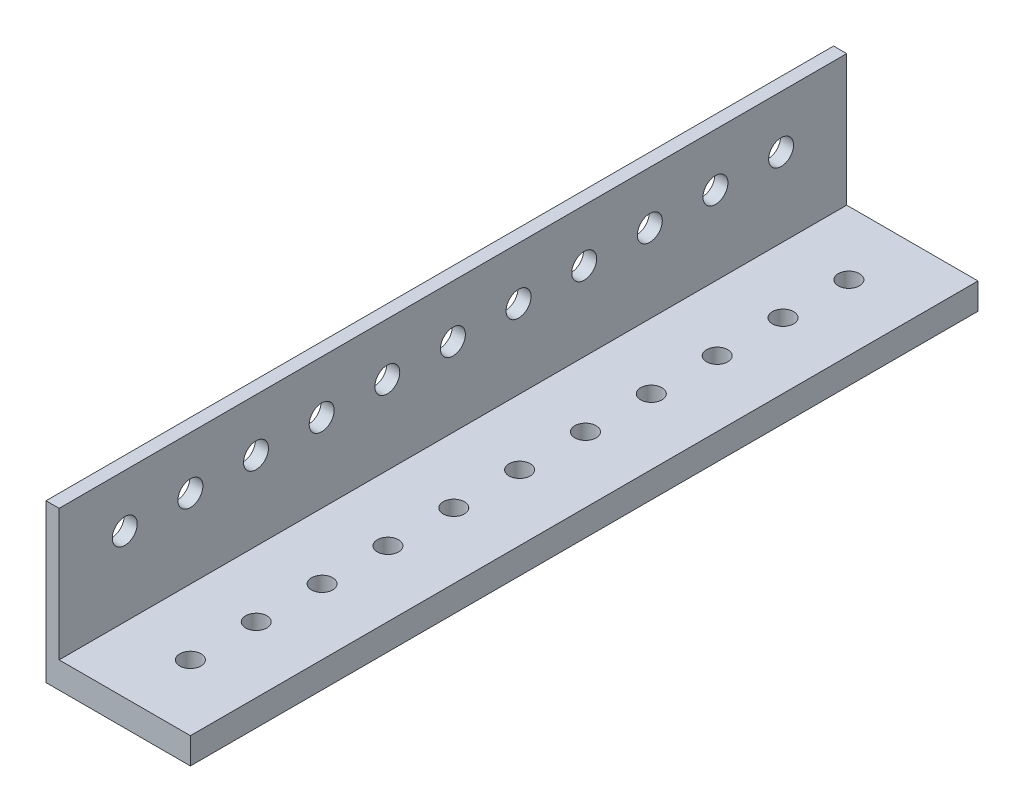
ISO-10303-21;
HEADER;
FILE_DESCRIPTION(('STEP AP214'),'2;1');
FILE_NAME('part.step','',(''),(''),'','','');
FILE_SCHEMA(('AUTOMOTIVE_DESIGN { 1 0 10303 214 1 1 1 1 }'));
ENDSEC;
DATA;
#1=APPLICATION_CONTEXT('core data for automotive mechanical design processes');
#2=APPLICATION_PROTOCOL_DEFINITION('international standard','automotive_design',2000,#1);
#3=PRODUCT_CONTEXT('',#1,'mechanical');
#4=PRODUCT('Part','Part','',(#3));
#5=PRODUCT_RELATED_PRODUCT_CATEGORY('part','',(#4));
#6=PRODUCT_DEFINITION_FORMATION('','',#4);
#7=PRODUCT_DEFINITION_CONTEXT('part definition',#1,'design');
#8=PRODUCT_DEFINITION('design','',#6,#7);
#9=PRODUCT_DEFINITION_SHAPE('','',#8);
#10=(LENGTH_UNIT() NAMED_UNIT(*) SI_UNIT(.MILLI.,.METRE.));
#11=(NAMED_UNIT(*) PLANE_ANGLE_UNIT() SI_UNIT($,.RADIAN.));
#12=(NAMED_UNIT(*) SI_UNIT($,.STERADIAN.) SOLID_ANGLE_UNIT());
#13=UNCERTAINTY_MEASURE_WITH_UNIT(LENGTH_MEASURE(1.E-05),#10,'distance_accuracy_value','');
#14=(GEOMETRIC_REPRESENTATION_CONTEXT(3) GLOBAL_UNCERTAINTY_ASSIGNED_CONTEXT((#13)) GLOBAL_UNIT_ASSIGNED_CONTEXT((#10,
#11,#12)) REPRESENTATION_CONTEXT('',''));
#15=CARTESIAN_POINT('',(0.,0.,0.));
#16=DIRECTION('',(0.,0.,1.));
#17=DIRECTION('',(1.,0.,0.));
#18=AXIS2_PLACEMENT_3D('',#15,#16,#17);
#19=CARTESIAN_POINT('',(2.54,0.,0.));
#20=DIRECTION('',(1.,0.,0.));
#21=DIRECTION('',(0.,0.,-1.));
#22=AXIS2_PLACEMENT_3D('',#19,#20,#21);
#23=PLANE('',#22);
#24=DIRECTION('',(0.,0.,1.));
#25=VECTOR('',#24,1.);
#26=CARTESIAN_POINT('',(2.54,-10.3896808510638,11.2050127762405));
#27=LINE('',#26,#25);
#28=CARTESIAN_POINT('',(2.54,-10.3896808510638,-141.194987223759));
#29=VERTEX_POINT('',#28);
#30=CARTESIAN_POINT('',(2.54,-10.3896808510638,11.2050127762405));
#31=VERTEX_POINT('',#30);
#32=EDGE_CURVE('E54',#29,#31,#27,.T.);
#33=ORIENTED_EDGE('',*,*,#32,.F.);
#34=DIRECTION('',(0.,1.,0.));
#35=VECTOR('',#34,1.);
#36=CARTESIAN_POINT('',(2.54,15.0103191489362,-141.194987223759));
#37=LINE('',#36,#35);
#38=CARTESIAN_POINT('',(2.54,15.0103191489362,-141.194987223759));
#39=VERTEX_POINT('',#38);
#40=EDGE_CURVE('E210',#29,#39,#37,.T.);
#41=ORIENTED_EDGE('',*,*,#40,.T.);
#42=DIRECTION('',(0.,0.,1.));
#43=VECTOR('',#42,1.);
#44=CARTESIAN_POINT('',(2.54,15.0103191489362,11.2050127762406));
#45=LINE('',#44,#43);
#46=CARTESIAN_POINT('',(2.54,15.0103191489362,11.2050127762406));
#47=VERTEX_POINT('',#46);
#48=EDGE_CURVE('E60',#39,#47,#45,.T.);
#49=ORIENTED_EDGE('',*,*,#48,.T.);
#50=DIRECTION('',(0.,-1.,0.));
#51=VECTOR('',#50,1.);
#52=CARTESIAN_POINT('',(2.54,15.0103191489362,11.2050127762406));
#53=LINE('',#52,#51);
#54=EDGE_CURVE('E89',#47,#31,#53,.T.);
#55=ORIENTED_EDGE('',*,*,#54,.T.);
#56=EDGE_LOOP('',(#33,#41,#49,#55));
#57=FACE_BOUND('',#56,.T.);
#58=CARTESIAN_POINT('',(2.54,4.85031914893617,-115.794987223759));
#59=DIRECTION('',(1.,0.,0.));
#60=DIRECTION('',(0.,0.,-1.));
#61=AXIS2_PLACEMENT_3D('',#58,#59,#60);
#62=CIRCLE('',#61,2.41300000000001);
#63=CARTESIAN_POINT('',(2.54,4.85031914893617,-118.207987223759));
#64=VERTEX_POINT('',#63);
#65=EDGE_CURVE('E155',#64,#64,#62,.T.);
#66=ORIENTED_EDGE('',*,*,#65,.F.);
#67=EDGE_LOOP('',(#66));
#68=FACE_BOUND('',#67,.T.);
#69=CARTESIAN_POINT('',(2.54,4.85031914893617,-90.3949872237594));
#70=DIRECTION('',(1.,0.,0.));
#71=DIRECTION('',(0.,0.,-1.));
#72=AXIS2_PLACEMENT_3D('',#69,#70,#71);
#73=CIRCLE('',#72,2.41300000000001);
#74=CARTESIAN_POINT('',(2.54,4.85031914893617,-92.8079872237595));
#75=VERTEX_POINT('',#74);
#76=EDGE_CURVE('E167',#75,#75,#73,.T.);
#77=ORIENTED_EDGE('',*,*,#76,.F.);
#78=EDGE_LOOP('',(#77));
#79=FACE_BOUND('',#78,.T.);
#80=CARTESIAN_POINT('',(2.54,4.85031914893617,-64.9949872237595));
#81=DIRECTION('',(1.,0.,0.));
#82=DIRECTION('',(0.,0.,-1.));
#83=AXIS2_PLACEMENT_3D('',#80,#81,#82);
#84=CIRCLE('',#83,2.41300000000001);
#85=CARTESIAN_POINT('',(2.54,4.85031914893617,-67.4079872237595));
#86=VERTEX_POINT('',#85);
#87=EDGE_CURVE('E179',#86,#86,#84,.T.);
#88=ORIENTED_EDGE('',*,*,#87,.F.);
#89=EDGE_LOOP('',(#88));
#90=FACE_BOUND('',#89,.T.);
#91=CARTESIAN_POINT('',(2.54,4.85031914893617,-39.5949872237594));
#92=DIRECTION('',(1.,0.,0.));
#93=DIRECTION('',(0.,0.,-1.));
#94=AXIS2_PLACEMENT_3D('',#91,#92,#93);
#95=CIRCLE('',#94,2.413);
#96=CARTESIAN_POINT('',(2.54,4.85031914893617,-42.0079872237595));
#97=VERTEX_POINT('',#96);
#98=EDGE_CURVE('E191',#97,#97,#95,.T.);
#99=ORIENTED_EDGE('',*,*,#98,.F.);
#100=EDGE_LOOP('',(#99));
#101=FACE_BOUND('',#100,.T.);
#102=CARTESIAN_POINT('',(2.54,4.85031914893617,-14.1949872237594));
#103=DIRECTION('',(1.,0.,0.));
#104=DIRECTION('',(0.,0.,-1.));
#105=AXIS2_PLACEMENT_3D('',#102,#103,#104);
#106=CIRCLE('',#105,2.413);
#107=CARTESIAN_POINT('',(2.54,4.85031914893617,-16.6079872237594));
#108=VERTEX_POINT('',#107);
#109=EDGE_CURVE('E203',#108,#108,#106,.T.);
#110=ORIENTED_EDGE('',*,*,#109,.F.);
#111=EDGE_LOOP('',(#110));
#112=FACE_BOUND('',#111,.T.);
#113=CARTESIAN_POINT('',(2.54,4.85031914893617,-1.49498722375945));
#114=DIRECTION('',(1.,0.,0.));
#115=DIRECTION('',(0.,0.,-1.));
#116=AXIS2_PLACEMENT_3D('',#113,#114,#115);
#117=CIRCLE('',#116,2.413);
#118=CARTESIAN_POINT('',(2.54,4.85031914893617,-3.90798722375945));
#119=VERTEX_POINT('',#118);
#120=EDGE_CURVE('E101',#119,#119,#117,.T.);
#121=ORIENTED_EDGE('',*,*,#120,.F.);
#122=EDGE_LOOP('',(#121));
#123=FACE_BOUND('',#122,.T.);
#124=CARTESIAN_POINT('',(2.54,4.85031914893617,-26.8949872237594));
#125=DIRECTION('',(1.,0.,0.));
#126=DIRECTION('',(0.,0.,-1.));
#127=AXIS2_PLACEMENT_3D('',#124,#125,#126);
#128=CIRCLE('',#127,2.413);
#129=CARTESIAN_POINT('',(2.54,4.85031914893617,-29.3079872237595));
#130=VERTEX_POINT('',#129);
#131=EDGE_CURVE('E197',#130,#130,#128,.T.);
#132=ORIENTED_EDGE('',*,*,#131,.F.);
#133=EDGE_LOOP('',(#132));
#134=FACE_BOUND('',#133,.T.);
#135=CARTESIAN_POINT('',(2.54,4.85031914893617,-52.2949872237594));
#136=DIRECTION('',(1.,0.,0.));
#137=DIRECTION('',(0.,0.,-1.));
#138=AXIS2_PLACEMENT_3D('',#135,#136,#137);
#139=CIRCLE('',#138,2.413);
#140=CARTESIAN_POINT('',(2.54,4.85031914893617,-54.7079872237595));
#141=VERTEX_POINT('',#140);
#142=EDGE_CURVE('E185',#141,#141,#139,.T.);
#143=ORIENTED_EDGE('',*,*,#142,.F.);
#144=EDGE_LOOP('',(#143));
#145=FACE_BOUND('',#144,.T.);
#146=CARTESIAN_POINT('',(2.54,4.85031914893617,-77.6949872237594));
#147=DIRECTION('',(1.,0.,0.));
#148=DIRECTION('',(0.,0.,-1.));
#149=AXIS2_PLACEMENT_3D('',#146,#147,#148);
#150=CIRCLE('',#149,2.41300000000001);
#151=CARTESIAN_POINT('',(2.54,4.85031914893617,-80.1079872237595));
#152=VERTEX_POINT('',#151);
#153=EDGE_CURVE('E173',#152,#152,#150,.T.);
#154=ORIENTED_EDGE('',*,*,#153,.F.);
#155=EDGE_LOOP('',(#154));
#156=FACE_BOUND('',#155,.T.);
#157=CARTESIAN_POINT('',(2.54,4.85031914893617,-103.094987223759));
#158=DIRECTION('',(1.,0.,0.));
#159=DIRECTION('',(0.,0.,-1.));
#160=AXIS2_PLACEMENT_3D('',#157,#158,#159);
#161=CIRCLE('',#160,2.41300000000001);
#162=CARTESIAN_POINT('',(2.54,4.85031914893617,-105.507987223759));
#163=VERTEX_POINT('',#162);
#164=EDGE_CURVE('E161',#163,#163,#161,.T.);
#165=ORIENTED_EDGE('',*,*,#164,.F.);
#166=EDGE_LOOP('',(#165));
#167=FACE_BOUND('',#166,.T.);
#168=CARTESIAN_POINT('',(2.54,4.85031914893617,-128.494987223759));
#169=DIRECTION('',(1.,0.,0.));
#170=DIRECTION('',(0.,0.,-1.));
#171=AXIS2_PLACEMENT_3D('',#168,#169,#170);
#172=CIRCLE('',#171,2.413);
#173=CARTESIAN_POINT('',(2.54,4.85031914893617,-130.907987223759));
#174=VERTEX_POINT('',#173);
#175=EDGE_CURVE('E149',#174,#174,#172,.T.);
#176=ORIENTED_EDGE('',*,*,#175,.F.);
#177=EDGE_LOOP('',(#176));
#178=FACE_BOUND('',#177,.T.);
#179=ADVANCED_FACE('F39',(#57,#68,#79,#90,#101,#112,#123,#134,#145,#156,#167,#178),#23,.T.);
#180=CARTESIAN_POINT('',(0.,0.,0.));
#181=DIRECTION('',(1.,0.,0.));
#182=DIRECTION('',(0.,0.,-1.));
#183=AXIS2_PLACEMENT_3D('',#180,#181,#182);
#184=PLANE('',#183);
#185=DIRECTION('',(0.,-1.,0.));
#186=VECTOR('',#185,1.);
#187=CARTESIAN_POINT('',(0.,15.0103191489362,11.2050127762406));
#188=LINE('',#187,#186);
#189=CARTESIAN_POINT('',(0.,15.0103191489362,11.2050127762406));
#190=VERTEX_POINT('',#189);
#191=CARTESIAN_POINT('',(0.,-15.4696808510638,11.2050127762405));
#192=VERTEX_POINT('',#191);
#193=EDGE_CURVE('E95',#190,#192,#188,.T.);
#194=ORIENTED_EDGE('',*,*,#193,.F.);
#195=DIRECTION('',(0.,0.,1.));
#196=VECTOR('',#195,1.);
#197=CARTESIAN_POINT('',(0.,15.0103191489362,11.2050127762406));
#198=LINE('',#197,#196);
#199=CARTESIAN_POINT('',(0.,15.0103191489362,-141.194987223759));
#200=VERTEX_POINT('',#199);
#201=EDGE_CURVE('E79',#200,#190,#198,.T.);
#202=ORIENTED_EDGE('',*,*,#201,.F.);
#203=DIRECTION('',(0.,1.,0.));
#204=VECTOR('',#203,1.);
#205=CARTESIAN_POINT('',(0.,15.0103191489362,-141.194987223759));
#206=LINE('',#205,#204);
#207=CARTESIAN_POINT('',(0.,-15.4696808510638,-141.194987223759));
#208=VERTEX_POINT('',#207);
#209=EDGE_CURVE('E90',#208,#200,#206,.T.);
#210=ORIENTED_EDGE('',*,*,#209,.F.);
#211=DIRECTION('',(0.,0.,-1.));
#212=VECTOR('',#211,1.);
#213=CARTESIAN_POINT('',(0.,-15.4696808510638,11.2050127762405));
#214=LINE('',#213,#212);
#215=EDGE_CURVE('E100',#192,#208,#214,.T.);
#216=ORIENTED_EDGE('',*,*,#215,.F.);
#217=EDGE_LOOP('',(#194,#202,#210,#216));
#218=FACE_BOUND('',#217,.T.);
#219=CARTESIAN_POINT('',(0.,4.85031914893617,-1.49498722375945));
#220=DIRECTION('',(1.,0.,0.));
#221=DIRECTION('',(0.,0.,-1.));
#222=AXIS2_PLACEMENT_3D('',#219,#220,#221);
#223=CIRCLE('',#222,2.413);
#224=CARTESIAN_POINT('',(0.,4.85031914893617,-3.90798722375945));
#225=VERTEX_POINT('',#224);
#226=EDGE_CURVE('E105',#225,#225,#223,.T.);
#227=ORIENTED_EDGE('',*,*,#226,.T.);
#228=EDGE_LOOP('',(#227));
#229=FACE_BOUND('',#228,.T.);
#230=CARTESIAN_POINT('',(0.,4.85031914893617,-14.1949872237594));
#231=DIRECTION('',(1.,0.,0.));
#232=DIRECTION('',(0.,0.,-1.));
#233=AXIS2_PLACEMENT_3D('',#230,#231,#232);
#234=CIRCLE('',#233,2.413);
#235=CARTESIAN_POINT('',(0.,4.85031914893617,-16.6079872237594));
#236=VERTEX_POINT('',#235);
#237=EDGE_CURVE('E200',#236,#236,#234,.T.);
#238=ORIENTED_EDGE('',*,*,#237,.T.);
#239=EDGE_LOOP('',(#238));
#240=FACE_BOUND('',#239,.T.);
#241=CARTESIAN_POINT('',(0.,4.85031914893617,-26.8949872237594));
#242=DIRECTION('',(1.,0.,0.));
#243=DIRECTION('',(0.,0.,-1.));
#244=AXIS2_PLACEMENT_3D('',#241,#242,#243);
#245=CIRCLE('',#244,2.413);
#246=CARTESIAN_POINT('',(0.,4.85031914893617,-29.3079872237595));
#247=VERTEX_POINT('',#246);
#248=EDGE_CURVE('E194',#247,#247,#245,.T.);
#249=ORIENTED_EDGE('',*,*,#248,.T.);
#250=EDGE_LOOP('',(#249));
#251=FACE_BOUND('',#250,.T.);
#252=CARTESIAN_POINT('',(0.,4.85031914893617,-39.5949872237594));
#253=DIRECTION('',(1.,0.,0.));
#254=DIRECTION('',(0.,0.,-1.));
#255=AXIS2_PLACEMENT_3D('',#252,#253,#254);
#256=CIRCLE('',#255,2.413);
#257=CARTESIAN_POINT('',(0.,4.85031914893617,-42.0079872237595));
#258=VERTEX_POINT('',#257);
#259=EDGE_CURVE('E188',#258,#258,#256,.T.);
#260=ORIENTED_EDGE('',*,*,#259,.T.);
#261=EDGE_LOOP('',(#260));
#262=FACE_BOUND('',#261,.T.);
#263=CARTESIAN_POINT('',(0.,4.85031914893617,-52.2949872237594));
#264=DIRECTION('',(1.,0.,0.));
#265=DIRECTION('',(0.,0.,-1.));
#266=AXIS2_PLACEMENT_3D('',#263,#264,#265);
#267=CIRCLE('',#266,2.413);
#268=CARTESIAN_POINT('',(0.,4.85031914893617,-54.7079872237595));
#269=VERTEX_POINT('',#268);
#270=EDGE_CURVE('E182',#269,#269,#267,.T.);
#271=ORIENTED_EDGE('',*,*,#270,.T.);
#272=EDGE_LOOP('',(#271));
#273=FACE_BOUND('',#272,.T.);
#274=CARTESIAN_POINT('',(0.,4.85031914893617,-64.9949872237595));
#275=DIRECTION('',(1.,0.,0.));
#276=DIRECTION('',(0.,0.,-1.));
#277=AXIS2_PLACEMENT_3D('',#274,#275,#276);
#278=CIRCLE('',#277,2.41300000000001);
#279=CARTESIAN_POINT('',(0.,4.85031914893617,-67.4079872237595));
#280=VERTEX_POINT('',#279);
#281=EDGE_CURVE('E176',#280,#280,#278,.T.);
#282=ORIENTED_EDGE('',*,*,#281,.T.);
#283=EDGE_LOOP('',(#282));
#284=FACE_BOUND('',#283,.T.);
#285=CARTESIAN_POINT('',(0.,4.85031914893617,-77.6949872237594));
#286=DIRECTION('',(1.,0.,0.));
#287=DIRECTION('',(0.,0.,-1.));
#288=AXIS2_PLACEMENT_3D('',#285,#286,#287);
#289=CIRCLE('',#288,2.41300000000001);
#290=CARTESIAN_POINT('',(0.,4.85031914893617,-80.1079872237595));
#291=VERTEX_POINT('',#290);
#292=EDGE_CURVE('E170',#291,#291,#289,.T.);
#293=ORIENTED_EDGE('',*,*,#292,.T.);
#294=EDGE_LOOP('',(#293));
#295=FACE_BOUND('',#294,.T.);
#296=CARTESIAN_POINT('',(0.,4.85031914893617,-90.3949872237594));
#297=DIRECTION('',(1.,0.,0.));
#298=DIRECTION('',(0.,0.,-1.));
#299=AXIS2_PLACEMENT_3D('',#296,#297,#298);
#300=CIRCLE('',#299,2.41300000000001);
#301=CARTESIAN_POINT('',(0.,4.85031914893617,-92.8079872237595));
#302=VERTEX_POINT('',#301);
#303=EDGE_CURVE('E164',#302,#302,#300,.T.);
#304=ORIENTED_EDGE('',*,*,#303,.T.);
#305=EDGE_LOOP('',(#304));
#306=FACE_BOUND('',#305,.T.);
#307=CARTESIAN_POINT('',(0.,4.85031914893617,-103.094987223759));
#308=DIRECTION('',(1.,0.,0.));
#309=DIRECTION('',(0.,0.,-1.));
#310=AXIS2_PLACEMENT_3D('',#307,#308,#309);
#311=CIRCLE('',#310,2.41300000000001);
#312=CARTESIAN_POINT('',(0.,4.85031914893617,-105.507987223759));
#313=VERTEX_POINT('',#312);
#314=EDGE_CURVE('E158',#313,#313,#311,.T.);
#315=ORIENTED_EDGE('',*,*,#314,.T.);
#316=EDGE_LOOP('',(#315));
#317=FACE_BOUND('',#316,.T.);
#318=CARTESIAN_POINT('',(0.,4.85031914893617,-115.794987223759));
#319=DIRECTION('',(1.,0.,0.));
#320=DIRECTION('',(0.,0.,-1.));
#321=AXIS2_PLACEMENT_3D('',#318,#319,#320);
#322=CIRCLE('',#321,2.41300000000001);
#323=CARTESIAN_POINT('',(0.,4.85031914893617,-118.207987223759));
#324=VERTEX_POINT('',#323);
#325=EDGE_CURVE('E152',#324,#324,#322,.T.);
#326=ORIENTED_EDGE('',*,*,#325,.T.);
#327=EDGE_LOOP('',(#326));
#328=FACE_BOUND('',#327,.T.);
#329=CARTESIAN_POINT('',(0.,4.85031914893617,-128.494987223759));
#330=DIRECTION('',(1.,0.,0.));
#331=DIRECTION('',(0.,0.,-1.));
#332=AXIS2_PLACEMENT_3D('',#329,#330,#331);
#333=CIRCLE('',#332,2.413);
#334=CARTESIAN_POINT('',(0.,4.85031914893617,-130.907987223759));
#335=VERTEX_POINT('',#334);
#336=EDGE_CURVE('E148',#335,#335,#333,.T.);
#337=ORIENTED_EDGE('',*,*,#336,.T.);
#338=EDGE_LOOP('',(#337));
#339=FACE_BOUND('',#338,.T.);
#340=ADVANCED_FACE('F98',(#218,#229,#240,#251,#262,#273,#284,#295,#306,#317,#328,#339),#184,.F.);
#341=CARTESIAN_POINT('',(2.54,15.0103191489362,11.2050127762406));
#342=DIRECTION('',(0.,0.,-1.));
#343=DIRECTION('',(0.,1.,0.));
#344=AXIS2_PLACEMENT_3D('',#341,#342,#343);
#345=PLANE('',#344);
#346=ORIENTED_EDGE('',*,*,#193,.T.);
#347=DIRECTION('',(-1.,0.,0.));
#348=VECTOR('',#347,1.);
#349=CARTESIAN_POINT('',(2.54,-15.4696808510638,11.2050127762405));
#350=LINE('',#349,#348);
#351=CARTESIAN_POINT('',(27.94,-15.4696808510638,11.2050127762405));
#352=VERTEX_POINT('',#351);
#353=EDGE_CURVE('E11',#352,#192,#350,.T.);
#354=ORIENTED_EDGE('',*,*,#353,.F.);
#355=DIRECTION('',(0.,-1.,0.));
#356=VECTOR('',#355,1.);
#357=CARTESIAN_POINT('',(27.94,-15.4696808510638,11.2050127762405));
#358=LINE('',#357,#356);
#359=CARTESIAN_POINT('',(27.94,-10.3896808510638,11.2050127762405));
#360=VERTEX_POINT('',#359);
#361=EDGE_CURVE('E133',#360,#352,#358,.T.);
#362=ORIENTED_EDGE('',*,*,#361,.F.);
#363=DIRECTION('',(-1.,0.,0.));
#364=VECTOR('',#363,1.);
#365=CARTESIAN_POINT('',(27.94,-10.3896808510638,11.2050127762405));
#366=LINE('',#365,#364);
#367=EDGE_CURVE('E141',#360,#31,#366,.T.);
#368=ORIENTED_EDGE('',*,*,#367,.T.);
#369=ORIENTED_EDGE('',*,*,#54,.F.);
#370=DIRECTION('',(-1.,0.,0.));
#371=VECTOR('',#370,1.);
#372=CARTESIAN_POINT('',(2.54,15.0103191489362,11.2050127762406));
#373=LINE('',#372,#371);
#374=EDGE_CURVE('E82',#47,#190,#373,.T.);
#375=ORIENTED_EDGE('',*,*,#374,.T.);
#376=EDGE_LOOP('',(#346,#354,#362,#368,#369,#375));
#377=FACE_BOUND('',#376,.T.);
#378=ADVANCED_FACE('F41',(#377),#345,.F.);
#379=CARTESIAN_POINT('',(2.54,-15.4696808510638,11.2050127762405));
#380=DIRECTION('',(0.,1.,0.));
#381=DIRECTION('',(0.,0.,1.));
#382=AXIS2_PLACEMENT_3D('',#379,#380,#381);
#383=PLANE('',#382);
#384=CARTESIAN_POINT('',(15.24,-15.4696808510638,-1.49498722375945));
#385=DIRECTION('',(0.,1.,0.));
#386=DIRECTION('',(0.,0.,1.));
#387=AXIS2_PLACEMENT_3D('',#384,#385,#386);
#388=CIRCLE('',#387,2.05446934605813);
#389=CARTESIAN_POINT('',(15.24,-15.4696808510638,0.559482122298679));
#390=VERTEX_POINT('',#389);
#391=EDGE_CURVE('E143',#390,#390,#388,.T.);
#392=ORIENTED_EDGE('',*,*,#391,.T.);
#393=EDGE_LOOP('',(#392));
#394=FACE_BOUND('',#393,.T.);
#395=CARTESIAN_POINT('',(15.24,-15.4696808510638,-14.2361292724872));
#396=DIRECTION('',(0.,1.,0.));
#397=DIRECTION('',(0.,0.,1.));
#398=AXIS2_PLACEMENT_3D('',#395,#396,#397);
#399=CIRCLE('',#398,2.05446934605813);
#400=CARTESIAN_POINT('',(15.24,-15.4696808510638,-12.1816599264291));
#401=VERTEX_POINT('',#400);
#402=EDGE_CURVE('E260',#401,#401,#399,.T.);
#403=ORIENTED_EDGE('',*,*,#402,.T.);
#404=EDGE_LOOP('',(#403));
#405=FACE_BOUND('',#404,.T.);
#406=CARTESIAN_POINT('',(15.24,-15.4696808510638,-26.9772713212149));
#407=DIRECTION('',(0.,1.,0.));
#408=DIRECTION('',(0.,0.,1.));
#409=AXIS2_PLACEMENT_3D('',#406,#407,#408);
#410=CIRCLE('',#409,2.05446934605813);
#411=CARTESIAN_POINT('',(15.24,-15.4696808510638,-24.9228019751568));
#412=VERTEX_POINT('',#411);
#413=EDGE_CURVE('E264',#412,#412,#410,.T.);
#414=ORIENTED_EDGE('',*,*,#413,.T.);
#415=EDGE_LOOP('',(#414));
#416=FACE_BOUND('',#415,.T.);
#417=CARTESIAN_POINT('',(15.24,-15.4696808510638,-39.7184133699427));
#418=DIRECTION('',(0.,1.,0.));
#419=DIRECTION('',(0.,0.,1.));
#420=AXIS2_PLACEMENT_3D('',#417,#418,#419);
#421=CIRCLE('',#420,2.05446934605813);
#422=CARTESIAN_POINT('',(15.24,-15.4696808510638,-37.6639440238846));
#423=VERTEX_POINT('',#422);
#424=EDGE_CURVE('E268',#423,#423,#421,.T.);
#425=ORIENTED_EDGE('',*,*,#424,.T.);
#426=EDGE_LOOP('',(#425));
#427=FACE_BOUND('',#426,.T.);
#428=CARTESIAN_POINT('',(15.24,-15.4696808510638,-52.4595554186704));
#429=DIRECTION('',(0.,1.,0.));
#430=DIRECTION('',(0.,0.,1.));
#431=AXIS2_PLACEMENT_3D('',#428,#429,#430);
#432=CIRCLE('',#431,2.05446934605813);
#433=CARTESIAN_POINT('',(15.24,-15.4696808510638,-50.4050860726123));
#434=VERTEX_POINT('',#433);
#435=EDGE_CURVE('E272',#434,#434,#432,.T.);
#436=ORIENTED_EDGE('',*,*,#435,.T.);
#437=EDGE_LOOP('',(#436));
#438=FACE_BOUND('',#437,.T.);
#439=CARTESIAN_POINT('',(15.24,-15.4696808510638,-65.2006974673982));
#440=DIRECTION('',(0.,1.,0.));
#441=DIRECTION('',(0.,0.,1.));
#442=AXIS2_PLACEMENT_3D('',#439,#440,#441);
#443=CIRCLE('',#442,2.05446934605813);
#444=CARTESIAN_POINT('',(15.24,-15.4696808510638,-63.14622812134));
#445=VERTEX_POINT('',#444);
#446=EDGE_CURVE('E276',#445,#445,#443,.T.);
#447=ORIENTED_EDGE('',*,*,#446,.T.);
#448=EDGE_LOOP('',(#447));
#449=FACE_BOUND('',#448,.T.);
#450=CARTESIAN_POINT('',(15.24,-15.4696808510638,-77.9418395161259));
#451=DIRECTION('',(0.,1.,0.));
#452=DIRECTION('',(0.,0.,1.));
#453=AXIS2_PLACEMENT_3D('',#450,#451,#452);
#454=CIRCLE('',#453,2.05446934605813);
#455=CARTESIAN_POINT('',(15.24,-15.4696808510638,-75.8873701700678));
#456=VERTEX_POINT('',#455);
#457=EDGE_CURVE('E280',#456,#456,#454,.T.);
#458=ORIENTED_EDGE('',*,*,#457,.T.);
#459=EDGE_LOOP('',(#458));
#460=FACE_BOUND('',#459,.T.);
#461=CARTESIAN_POINT('',(15.24,-15.4696808510638,-90.6829815648537));
#462=DIRECTION('',(0.,1.,0.));
#463=DIRECTION('',(0.,0.,1.));
#464=AXIS2_PLACEMENT_3D('',#461,#462,#463);
#465=CIRCLE('',#464,2.05446934605813);
#466=CARTESIAN_POINT('',(15.24,-15.4696808510638,-88.6285122187956));
#467=VERTEX_POINT('',#466);
#468=EDGE_CURVE('E284',#467,#467,#465,.T.);
#469=ORIENTED_EDGE('',*,*,#468,.T.);
#470=EDGE_LOOP('',(#469));
#471=FACE_BOUND('',#470,.T.);
#472=CARTESIAN_POINT('',(15.24,-15.4696808510638,-103.424123613581));
#473=DIRECTION('',(0.,1.,0.));
#474=DIRECTION('',(0.,0.,1.));
#475=AXIS2_PLACEMENT_3D('',#472,#473,#474);
#476=CIRCLE('',#475,2.05446934605813);
#477=CARTESIAN_POINT('',(15.24,-15.4696808510638,-101.369654267523));
#478=VERTEX_POINT('',#477);
#479=EDGE_CURVE('E288',#478,#478,#476,.T.);
#480=ORIENTED_EDGE('',*,*,#479,.T.);
#481=EDGE_LOOP('',(#480));
#482=FACE_BOUND('',#481,.T.);
#483=CARTESIAN_POINT('',(15.24,-15.4696808510638,-116.165265662309));
#484=DIRECTION('',(0.,1.,0.));
#485=DIRECTION('',(0.,0.,1.));
#486=AXIS2_PLACEMENT_3D('',#483,#484,#485);
#487=CIRCLE('',#486,2.05446934605813);
#488=CARTESIAN_POINT('',(15.24,-15.4696808510638,-114.110796316251));
#489=VERTEX_POINT('',#488);
#490=EDGE_CURVE('E292',#489,#489,#487,.T.);
#491=ORIENTED_EDGE('',*,*,#490,.T.);
#492=EDGE_LOOP('',(#491));
#493=FACE_BOUND('',#492,.T.);
#494=CARTESIAN_POINT('',(15.24,-15.4696808510638,-128.906407711037));
#495=DIRECTION('',(0.,1.,0.));
#496=DIRECTION('',(0.,0.,1.));
#497=AXIS2_PLACEMENT_3D('',#494,#495,#496);
#498=CIRCLE('',#497,2.05446934605813);
#499=CARTESIAN_POINT('',(15.24,-15.4696808510638,-126.851938364979));
#500=VERTEX_POINT('',#499);
#501=EDGE_CURVE('E295',#500,#500,#498,.T.);
#502=ORIENTED_EDGE('',*,*,#501,.T.);
#503=EDGE_LOOP('',(#502));
#504=FACE_BOUND('',#503,.T.);
#505=ORIENTED_EDGE('',*,*,#215,.T.);
#506=DIRECTION('',(-1.,0.,0.));
#507=VECTOR('',#506,1.);
#508=CARTESIAN_POINT('',(2.54,-15.4696808510638,-141.194987223759));
#509=LINE('',#508,#507);
#510=CARTESIAN_POINT('',(27.94,-15.4696808510638,-141.194987223759));
#511=VERTEX_POINT('',#510);
#512=EDGE_CURVE('E47',#511,#208,#509,.T.);
#513=ORIENTED_EDGE('',*,*,#512,.F.);
#514=DIRECTION('',(0.,0.,-1.));
#515=VECTOR('',#514,1.);
#516=CARTESIAN_POINT('',(27.94,-15.4696808510638,11.2050127762405));
#517=LINE('',#516,#515);
#518=EDGE_CURVE('E125',#352,#511,#517,.T.);
#519=ORIENTED_EDGE('',*,*,#518,.F.);
#520=ORIENTED_EDGE('',*,*,#353,.T.);
#521=EDGE_LOOP('',(#505,#513,#519,#520));
#522=FACE_BOUND('',#521,.T.);
#523=ADVANCED_FACE('F123',(#394,#405,#416,#427,#438,#449,#460,#471,#482,#493,#504,#522),#383,.F.);
#524=CARTESIAN_POINT('',(2.54,15.0103191489362,-141.194987223759));
#525=DIRECTION('',(0.,0.,1.));
#526=DIRECTION('',(1.,0.,0.));
#527=AXIS2_PLACEMENT_3D('',#524,#525,#526);
#528=PLANE('',#527);
#529=ORIENTED_EDGE('',*,*,#209,.T.);
#530=DIRECTION('',(-1.,0.,0.));
#531=VECTOR('',#530,1.);
#532=CARTESIAN_POINT('',(2.54,15.0103191489362,-141.194987223759));
#533=LINE('',#532,#531);
#534=EDGE_CURVE('E85',#39,#200,#533,.T.);
#535=ORIENTED_EDGE('',*,*,#534,.F.);
#536=ORIENTED_EDGE('',*,*,#40,.F.);
#537=DIRECTION('',(-1.,0.,0.));
#538=VECTOR('',#537,1.);
#539=CARTESIAN_POINT('',(27.94,-10.3896808510638,-141.194987223759));
#540=LINE('',#539,#538);
#541=CARTESIAN_POINT('',(27.94,-10.3896808510638,-141.194987223759));
#542=VERTEX_POINT('',#541);
#543=EDGE_CURVE('E145',#542,#29,#540,.T.);
#544=ORIENTED_EDGE('',*,*,#543,.F.);
#545=DIRECTION('',(0.,1.,0.));
#546=VECTOR('',#545,1.);
#547=CARTESIAN_POINT('',(27.94,-15.4696808510638,-141.194987223759));
#548=LINE('',#547,#546);
#549=EDGE_CURVE('E119',#511,#542,#548,.T.);
#550=ORIENTED_EDGE('',*,*,#549,.F.);
#551=ORIENTED_EDGE('',*,*,#512,.T.);
#552=EDGE_LOOP('',(#529,#535,#536,#544,#550,#551));
#553=FACE_BOUND('',#552,.T.);
#554=ADVANCED_FACE('F115',(#553),#528,.F.);
#555=CARTESIAN_POINT('',(2.54,15.0103191489362,11.2050127762406));
#556=DIRECTION('',(0.,-1.,0.));
#557=DIRECTION('',(0.,0.,-1.));
#558=AXIS2_PLACEMENT_3D('',#555,#556,#557);
#559=PLANE('',#558);
#560=ORIENTED_EDGE('',*,*,#201,.T.);
#561=ORIENTED_EDGE('',*,*,#374,.F.);
#562=ORIENTED_EDGE('',*,*,#48,.F.);
#563=ORIENTED_EDGE('',*,*,#534,.T.);
#564=EDGE_LOOP('',(#560,#561,#562,#563));
#565=FACE_BOUND('',#564,.T.);
#566=ADVANCED_FACE('F81',(#565),#559,.F.);
#567=CARTESIAN_POINT('',(2.54,4.85031914893617,-1.49498722375945));
#568=DIRECTION('',(-1.,0.,0.));
#569=DIRECTION('',(0.,0.,1.));
#570=AXIS2_PLACEMENT_3D('',#567,#568,#569);
#571=CYLINDRICAL_SURFACE('',#570,2.413);
#572=ORIENTED_EDGE('',*,*,#120,.T.);
#573=EDGE_LOOP('',(#572));
#574=FACE_BOUND('',#573,.T.);
#575=ORIENTED_EDGE('',*,*,#226,.F.);
#576=EDGE_LOOP('',(#575));
#577=FACE_BOUND('',#576,.T.);
#578=ADVANCED_FACE('F245',(#574,#577),#571,.F.);
#579=CARTESIAN_POINT('',(2.54,4.85031914893617,-14.1949872237594));
#580=DIRECTION('',(-1.,0.,0.));
#581=DIRECTION('',(0.,0.,1.));
#582=AXIS2_PLACEMENT_3D('',#579,#580,#581);
#583=CYLINDRICAL_SURFACE('',#582,2.413);
#584=ORIENTED_EDGE('',*,*,#109,.T.);
#585=EDGE_LOOP('',(#584));
#586=FACE_BOUND('',#585,.T.);
#587=ORIENTED_EDGE('',*,*,#237,.F.);
#588=EDGE_LOOP('',(#587));
#589=FACE_BOUND('',#588,.T.);
#590=ADVANCED_FACE('F535',(#586,#589),#583,.F.);
#591=CARTESIAN_POINT('',(2.54,4.85031914893617,-26.8949872237594));
#592=DIRECTION('',(-1.,0.,0.));
#593=DIRECTION('',(0.,0.,1.));
#594=AXIS2_PLACEMENT_3D('',#591,#592,#593);
#595=CYLINDRICAL_SURFACE('',#594,2.413);
#596=ORIENTED_EDGE('',*,*,#131,.T.);
#597=EDGE_LOOP('',(#596));
#598=FACE_BOUND('',#597,.T.);
#599=ORIENTED_EDGE('',*,*,#248,.F.);
#600=EDGE_LOOP('',(#599));
#601=FACE_BOUND('',#600,.T.);
#602=ADVANCED_FACE('F526',(#598,#601),#595,.F.);
#603=CARTESIAN_POINT('',(2.54,4.85031914893617,-39.5949872237594));
#604=DIRECTION('',(-1.,0.,0.));
#605=DIRECTION('',(0.,0.,1.));
#606=AXIS2_PLACEMENT_3D('',#603,#604,#605);
#607=CYLINDRICAL_SURFACE('',#606,2.413);
#608=ORIENTED_EDGE('',*,*,#98,.T.);
#609=EDGE_LOOP('',(#608));
#610=FACE_BOUND('',#609,.T.);
#611=ORIENTED_EDGE('',*,*,#259,.F.);
#612=EDGE_LOOP('',(#611));
#613=FACE_BOUND('',#612,.T.);
#614=ADVANCED_FACE('F517',(#610,#613),#607,.F.);
#615=CARTESIAN_POINT('',(2.54,4.85031914893617,-52.2949872237594));
#616=DIRECTION('',(-1.,0.,0.));
#617=DIRECTION('',(0.,0.,1.));
#618=AXIS2_PLACEMENT_3D('',#615,#616,#617);
#619=CYLINDRICAL_SURFACE('',#618,2.413);
#620=ORIENTED_EDGE('',*,*,#142,.T.);
#621=EDGE_LOOP('',(#620));
#622=FACE_BOUND('',#621,.T.);
#623=ORIENTED_EDGE('',*,*,#270,.F.);
#624=EDGE_LOOP('',(#623));
#625=FACE_BOUND('',#624,.T.);
#626=ADVANCED_FACE('F508',(#622,#625),#619,.F.);
#627=CARTESIAN_POINT('',(2.54,4.85031914893617,-64.9949872237595));
#628=DIRECTION('',(-1.,0.,0.));
#629=DIRECTION('',(0.,0.,1.));
#630=AXIS2_PLACEMENT_3D('',#627,#628,#629);
#631=CYLINDRICAL_SURFACE('',#630,2.41300000000001);
#632=ORIENTED_EDGE('',*,*,#87,.T.);
#633=EDGE_LOOP('',(#632));
#634=FACE_BOUND('',#633,.T.);
#635=ORIENTED_EDGE('',*,*,#281,.F.);
#636=EDGE_LOOP('',(#635));
#637=FACE_BOUND('',#636,.T.);
#638=ADVANCED_FACE('F499',(#634,#637),#631,.F.);
#639=CARTESIAN_POINT('',(2.54,4.85031914893617,-77.6949872237594));
#640=DIRECTION('',(-1.,0.,0.));
#641=DIRECTION('',(0.,0.,1.));
#642=AXIS2_PLACEMENT_3D('',#639,#640,#641);
#643=CYLINDRICAL_SURFACE('',#642,2.41300000000001);
#644=ORIENTED_EDGE('',*,*,#153,.T.);
#645=EDGE_LOOP('',(#644));
#646=FACE_BOUND('',#645,.T.);
#647=ORIENTED_EDGE('',*,*,#292,.F.);
#648=EDGE_LOOP('',(#647));
#649=FACE_BOUND('',#648,.T.);
#650=ADVANCED_FACE('F490',(#646,#649),#643,.F.);
#651=CARTESIAN_POINT('',(2.54,4.85031914893617,-90.3949872237594));
#652=DIRECTION('',(-1.,0.,0.));
#653=DIRECTION('',(0.,0.,1.));
#654=AXIS2_PLACEMENT_3D('',#651,#652,#653);
#655=CYLINDRICAL_SURFACE('',#654,2.41300000000001);
#656=ORIENTED_EDGE('',*,*,#76,.T.);
#657=EDGE_LOOP('',(#656));
#658=FACE_BOUND('',#657,.T.);
#659=ORIENTED_EDGE('',*,*,#303,.F.);
#660=EDGE_LOOP('',(#659));
#661=FACE_BOUND('',#660,.T.);
#662=ADVANCED_FACE('F481',(#658,#661),#655,.F.);
#663=CARTESIAN_POINT('',(2.54,4.85031914893617,-103.094987223759));
#664=DIRECTION('',(-1.,0.,0.));
#665=DIRECTION('',(0.,0.,1.));
#666=AXIS2_PLACEMENT_3D('',#663,#664,#665);
#667=CYLINDRICAL_SURFACE('',#666,2.41300000000001);
#668=ORIENTED_EDGE('',*,*,#164,.T.);
#669=EDGE_LOOP('',(#668));
#670=FACE_BOUND('',#669,.T.);
#671=ORIENTED_EDGE('',*,*,#314,.F.);
#672=EDGE_LOOP('',(#671));
#673=FACE_BOUND('',#672,.T.);
#674=ADVANCED_FACE('F472',(#670,#673),#667,.F.);
#675=CARTESIAN_POINT('',(2.54,4.85031914893617,-115.794987223759));
#676=DIRECTION('',(-1.,0.,0.));
#677=DIRECTION('',(0.,0.,1.));
#678=AXIS2_PLACEMENT_3D('',#675,#676,#677);
#679=CYLINDRICAL_SURFACE('',#678,2.41300000000001);
#680=ORIENTED_EDGE('',*,*,#65,.T.);
#681=EDGE_LOOP('',(#680));
#682=FACE_BOUND('',#681,.T.);
#683=ORIENTED_EDGE('',*,*,#325,.F.);
#684=EDGE_LOOP('',(#683));
#685=FACE_BOUND('',#684,.T.);
#686=ADVANCED_FACE('F232',(#682,#685),#679,.F.);
#687=CARTESIAN_POINT('',(2.54,4.85031914893617,-128.494987223759));
#688=DIRECTION('',(-1.,0.,0.));
#689=DIRECTION('',(0.,0.,1.));
#690=AXIS2_PLACEMENT_3D('',#687,#688,#689);
#691=CYLINDRICAL_SURFACE('',#690,2.413);
#692=ORIENTED_EDGE('',*,*,#175,.T.);
#693=EDGE_LOOP('',(#692));
#694=FACE_BOUND('',#693,.T.);
#695=ORIENTED_EDGE('',*,*,#336,.F.);
#696=EDGE_LOOP('',(#695));
#697=FACE_BOUND('',#696,.T.);
#698=ADVANCED_FACE('F221',(#694,#697),#691,.F.);
#699=CARTESIAN_POINT('',(27.94,-10.3896808510638,11.2050127762405));
#700=DIRECTION('',(0.,-1.,0.));
#701=DIRECTION('',(0.,0.,-1.));
#702=AXIS2_PLACEMENT_3D('',#699,#700,#701);
#703=PLANE('',#702);
#704=CARTESIAN_POINT('',(15.24,-10.3896808510638,-1.49498722375945));
#705=DIRECTION('',(0.,1.,0.));
#706=DIRECTION('',(0.,0.,1.));
#707=AXIS2_PLACEMENT_3D('',#704,#705,#706);
#708=CIRCLE('',#707,2.05446934605813);
#709=CARTESIAN_POINT('',(15.24,-10.3896808510638,0.559482122298679));
#710=VERTEX_POINT('',#709);
#711=EDGE_CURVE('E337',#710,#710,#708,.T.);
#712=ORIENTED_EDGE('',*,*,#711,.F.);
#713=EDGE_LOOP('',(#712));
#714=FACE_BOUND('',#713,.T.);
#715=CARTESIAN_POINT('',(15.24,-10.3896808510638,-14.2361292724872));
#716=DIRECTION('',(0.,1.,0.));
#717=DIRECTION('',(0.,0.,1.));
#718=AXIS2_PLACEMENT_3D('',#715,#716,#717);
#719=CIRCLE('',#718,2.05446934605813);
#720=CARTESIAN_POINT('',(15.24,-10.3896808510638,-12.1816599264291));
#721=VERTEX_POINT('',#720);
#722=EDGE_CURVE('E334',#721,#721,#719,.T.);
#723=ORIENTED_EDGE('',*,*,#722,.F.);
#724=EDGE_LOOP('',(#723));
#725=FACE_BOUND('',#724,.T.);
#726=CARTESIAN_POINT('',(15.24,-10.3896808510638,-26.9772713212149));
#727=DIRECTION('',(0.,1.,0.));
#728=DIRECTION('',(0.,0.,1.));
#729=AXIS2_PLACEMENT_3D('',#726,#727,#728);
#730=CIRCLE('',#729,2.05446934605813);
#731=CARTESIAN_POINT('',(15.24,-10.3896808510638,-24.9228019751568));
#732=VERTEX_POINT('',#731);
#733=EDGE_CURVE('E330',#732,#732,#730,.T.);
#734=ORIENTED_EDGE('',*,*,#733,.F.);
#735=EDGE_LOOP('',(#734));
#736=FACE_BOUND('',#735,.T.);
#737=CARTESIAN_POINT('',(15.24,-10.3896808510638,-39.7184133699427));
#738=DIRECTION('',(0.,1.,0.));
#739=DIRECTION('',(0.,0.,1.));
#740=AXIS2_PLACEMENT_3D('',#737,#738,#739);
#741=CIRCLE('',#740,2.05446934605813);
#742=CARTESIAN_POINT('',(15.24,-10.3896808510638,-37.6639440238846));
#743=VERTEX_POINT('',#742);
#744=EDGE_CURVE('E326',#743,#743,#741,.T.);
#745=ORIENTED_EDGE('',*,*,#744,.F.);
#746=EDGE_LOOP('',(#745));
#747=FACE_BOUND('',#746,.T.);
#748=CARTESIAN_POINT('',(15.24,-10.3896808510638,-52.4595554186704));
#749=DIRECTION('',(0.,1.,0.));
#750=DIRECTION('',(0.,0.,1.));
#751=AXIS2_PLACEMENT_3D('',#748,#749,#750);
#752=CIRCLE('',#751,2.05446934605813);
#753=CARTESIAN_POINT('',(15.24,-10.3896808510638,-50.4050860726123));
#754=VERTEX_POINT('',#753);
#755=EDGE_CURVE('E322',#754,#754,#752,.T.);
#756=ORIENTED_EDGE('',*,*,#755,.F.);
#757=EDGE_LOOP('',(#756));
#758=FACE_BOUND('',#757,.T.);
#759=CARTESIAN_POINT('',(15.24,-10.3896808510638,-65.2006974673982));
#760=DIRECTION('',(0.,1.,0.));
#761=DIRECTION('',(0.,0.,1.));
#762=AXIS2_PLACEMENT_3D('',#759,#760,#761);
#763=CIRCLE('',#762,2.05446934605813);
#764=CARTESIAN_POINT('',(15.24,-10.3896808510638,-63.14622812134));
#765=VERTEX_POINT('',#764);
#766=EDGE_CURVE('E318',#765,#765,#763,.T.);
#767=ORIENTED_EDGE('',*,*,#766,.F.);
#768=EDGE_LOOP('',(#767));
#769=FACE_BOUND('',#768,.T.);
#770=CARTESIAN_POINT('',(15.24,-10.3896808510638,-77.9418395161259));
#771=DIRECTION('',(0.,1.,0.));
#772=DIRECTION('',(0.,0.,1.));
#773=AXIS2_PLACEMENT_3D('',#770,#771,#772);
#774=CIRCLE('',#773,2.05446934605813);
#775=CARTESIAN_POINT('',(15.24,-10.3896808510638,-75.8873701700678));
#776=VERTEX_POINT('',#775);
#777=EDGE_CURVE('E314',#776,#776,#774,.T.);
#778=ORIENTED_EDGE('',*,*,#777,.F.);
#779=EDGE_LOOP('',(#778));
#780=FACE_BOUND('',#779,.T.);
#781=CARTESIAN_POINT('',(15.24,-10.3896808510638,-90.6829815648537));
#782=DIRECTION('',(0.,1.,0.));
#783=DIRECTION('',(0.,0.,1.));
#784=AXIS2_PLACEMENT_3D('',#781,#782,#783);
#785=CIRCLE('',#784,2.05446934605813);
#786=CARTESIAN_POINT('',(15.24,-10.3896808510638,-88.6285122187956));
#787=VERTEX_POINT('',#786);
#788=EDGE_CURVE('E310',#787,#787,#785,.T.);
#789=ORIENTED_EDGE('',*,*,#788,.F.);
#790=EDGE_LOOP('',(#789));
#791=FACE_BOUND('',#790,.T.);
#792=CARTESIAN_POINT('',(15.24,-10.3896808510638,-103.424123613581));
#793=DIRECTION('',(0.,1.,0.));
#794=DIRECTION('',(0.,0.,1.));
#795=AXIS2_PLACEMENT_3D('',#792,#793,#794);
#796=CIRCLE('',#795,2.05446934605813);
#797=CARTESIAN_POINT('',(15.24,-10.3896808510638,-101.369654267523));
#798=VERTEX_POINT('',#797);
#799=EDGE_CURVE('E306',#798,#798,#796,.T.);
#800=ORIENTED_EDGE('',*,*,#799,.F.);
#801=EDGE_LOOP('',(#800));
#802=FACE_BOUND('',#801,.T.);
#803=CARTESIAN_POINT('',(15.24,-10.3896808510638,-116.165265662309));
#804=DIRECTION('',(0.,1.,0.));
#805=DIRECTION('',(0.,0.,1.));
#806=AXIS2_PLACEMENT_3D('',#803,#804,#805);
#807=CIRCLE('',#806,2.05446934605813);
#808=CARTESIAN_POINT('',(15.24,-10.3896808510638,-114.110796316251));
#809=VERTEX_POINT('',#808);
#810=EDGE_CURVE('E302',#809,#809,#807,.T.);
#811=ORIENTED_EDGE('',*,*,#810,.F.);
#812=EDGE_LOOP('',(#811));
#813=FACE_BOUND('',#812,.T.);
#814=CARTESIAN_POINT('',(15.24,-10.3896808510638,-128.906407711037));
#815=DIRECTION('',(0.,1.,0.));
#816=DIRECTION('',(0.,0.,1.));
#817=AXIS2_PLACEMENT_3D('',#814,#815,#816);
#818=CIRCLE('',#817,2.05446934605813);
#819=CARTESIAN_POINT('',(15.24,-10.3896808510638,-126.851938364979));
#820=VERTEX_POINT('',#819);
#821=EDGE_CURVE('E297',#820,#820,#818,.T.);
#822=ORIENTED_EDGE('',*,*,#821,.F.);
#823=EDGE_LOOP('',(#822));
#824=FACE_BOUND('',#823,.T.);
#825=ORIENTED_EDGE('',*,*,#32,.T.);
#826=ORIENTED_EDGE('',*,*,#367,.F.);
#827=DIRECTION('',(0.,0.,1.));
#828=VECTOR('',#827,1.);
#829=CARTESIAN_POINT('',(27.94,-10.3896808510638,11.2050127762405));
#830=LINE('',#829,#828);
#831=EDGE_CURVE('E135',#542,#360,#830,.T.);
#832=ORIENTED_EDGE('',*,*,#831,.F.);
#833=ORIENTED_EDGE('',*,*,#543,.T.);
#834=EDGE_LOOP('',(#825,#826,#832,#833));
#835=FACE_BOUND('',#834,.T.);
#836=ADVANCED_FACE('F214',(#714,#725,#736,#747,#758,#769,#780,#791,#802,#813,#824,#835),#703,.F.);
#837=CARTESIAN_POINT('',(27.94,0.,0.));
#838=DIRECTION('',(-1.,0.,0.));
#839=DIRECTION('',(0.,0.,1.));
#840=AXIS2_PLACEMENT_3D('',#837,#838,#839);
#841=PLANE('',#840);
#842=ORIENTED_EDGE('',*,*,#361,.T.);
#843=ORIENTED_EDGE('',*,*,#518,.T.);
#844=ORIENTED_EDGE('',*,*,#549,.T.);
#845=ORIENTED_EDGE('',*,*,#831,.T.);
#846=EDGE_LOOP('',(#842,#843,#844,#845));
#847=FACE_BOUND('',#846,.T.);
#848=ADVANCED_FACE('F130',(#847),#841,.F.);
#849=CARTESIAN_POINT('',(15.24,-15.4696808510638,-128.906407711037));
#850=DIRECTION('',(0.,1.,0.));
#851=DIRECTION('',(0.,0.,1.));
#852=AXIS2_PLACEMENT_3D('',#849,#850,#851);
#853=CYLINDRICAL_SURFACE('',#852,2.05446934605813);
#854=ORIENTED_EDGE('',*,*,#501,.F.);
#855=EDGE_LOOP('',(#854));
#856=FACE_BOUND('',#855,.T.);
#857=ORIENTED_EDGE('',*,*,#821,.T.);
#858=EDGE_LOOP('',(#857));
#859=FACE_BOUND('',#858,.T.);
#860=ADVANCED_FACE('F229',(#856,#859),#853,.F.);
#861=CARTESIAN_POINT('',(15.24,-15.4696808510638,-116.165265662309));
#862=DIRECTION('',(0.,1.,0.));
#863=DIRECTION('',(0.,0.,1.));
#864=AXIS2_PLACEMENT_3D('',#861,#862,#863);
#865=CYLINDRICAL_SURFACE('',#864,2.05446934605813);
#866=ORIENTED_EDGE('',*,*,#490,.F.);
#867=EDGE_LOOP('',(#866));
#868=FACE_BOUND('',#867,.T.);
#869=ORIENTED_EDGE('',*,*,#810,.T.);
#870=EDGE_LOOP('',(#869));
#871=FACE_BOUND('',#870,.T.);
#872=ADVANCED_FACE('F379',(#868,#871),#865,.F.);
#873=CARTESIAN_POINT('',(15.24,-15.4696808510638,-103.424123613581));
#874=DIRECTION('',(0.,1.,0.));
#875=DIRECTION('',(0.,0.,1.));
#876=AXIS2_PLACEMENT_3D('',#873,#874,#875);
#877=CYLINDRICAL_SURFACE('',#876,2.05446934605813);
#878=ORIENTED_EDGE('',*,*,#479,.F.);
#879=EDGE_LOOP('',(#878));
#880=FACE_BOUND('',#879,.T.);
#881=ORIENTED_EDGE('',*,*,#799,.T.);
#882=EDGE_LOOP('',(#881));
#883=FACE_BOUND('',#882,.T.);
#884=ADVANCED_FACE('F375',(#880,#883),#877,.F.);
#885=CARTESIAN_POINT('',(15.24,-15.4696808510638,-90.6829815648537));
#886=DIRECTION('',(0.,1.,0.));
#887=DIRECTION('',(0.,0.,1.));
#888=AXIS2_PLACEMENT_3D('',#885,#886,#887);
#889=CYLINDRICAL_SURFACE('',#888,2.05446934605813);
#890=ORIENTED_EDGE('',*,*,#468,.F.);
#891=EDGE_LOOP('',(#890));
#892=FACE_BOUND('',#891,.T.);
#893=ORIENTED_EDGE('',*,*,#788,.T.);
#894=EDGE_LOOP('',(#893));
#895=FACE_BOUND('',#894,.T.);
#896=ADVANCED_FACE('F371',(#892,#895),#889,.F.);
#897=CARTESIAN_POINT('',(15.24,-15.4696808510638,-77.9418395161259));
#898=DIRECTION('',(0.,1.,0.));
#899=DIRECTION('',(0.,0.,1.));
#900=AXIS2_PLACEMENT_3D('',#897,#898,#899);
#901=CYLINDRICAL_SURFACE('',#900,2.05446934605813);
#902=ORIENTED_EDGE('',*,*,#457,.F.);
#903=EDGE_LOOP('',(#902));
#904=FACE_BOUND('',#903,.T.);
#905=ORIENTED_EDGE('',*,*,#777,.T.);
#906=EDGE_LOOP('',(#905));
#907=FACE_BOUND('',#906,.T.);
#908=ADVANCED_FACE('F367',(#904,#907),#901,.F.);
#909=CARTESIAN_POINT('',(15.24,-15.4696808510638,-65.2006974673982));
#910=DIRECTION('',(0.,1.,0.));
#911=DIRECTION('',(0.,0.,1.));
#912=AXIS2_PLACEMENT_3D('',#909,#910,#911);
#913=CYLINDRICAL_SURFACE('',#912,2.05446934605813);
#914=ORIENTED_EDGE('',*,*,#446,.F.);
#915=EDGE_LOOP('',(#914));
#916=FACE_BOUND('',#915,.T.);
#917=ORIENTED_EDGE('',*,*,#766,.T.);
#918=EDGE_LOOP('',(#917));
#919=FACE_BOUND('',#918,.T.);
#920=ADVANCED_FACE('F363',(#916,#919),#913,.F.);
#921=CARTESIAN_POINT('',(15.24,-15.4696808510638,-52.4595554186704));
#922=DIRECTION('',(0.,1.,0.));
#923=DIRECTION('',(0.,0.,1.));
#924=AXIS2_PLACEMENT_3D('',#921,#922,#923);
#925=CYLINDRICAL_SURFACE('',#924,2.05446934605813);
#926=ORIENTED_EDGE('',*,*,#435,.F.);
#927=EDGE_LOOP('',(#926));
#928=FACE_BOUND('',#927,.T.);
#929=ORIENTED_EDGE('',*,*,#755,.T.);
#930=EDGE_LOOP('',(#929));
#931=FACE_BOUND('',#930,.T.);
#932=ADVANCED_FACE('F359',(#928,#931),#925,.F.);
#933=CARTESIAN_POINT('',(15.24,-15.4696808510638,-39.7184133699427));
#934=DIRECTION('',(0.,1.,0.));
#935=DIRECTION('',(0.,0.,1.));
#936=AXIS2_PLACEMENT_3D('',#933,#934,#935);
#937=CYLINDRICAL_SURFACE('',#936,2.05446934605813);
#938=ORIENTED_EDGE('',*,*,#424,.F.);
#939=EDGE_LOOP('',(#938));
#940=FACE_BOUND('',#939,.T.);
#941=ORIENTED_EDGE('',*,*,#744,.T.);
#942=EDGE_LOOP('',(#941));
#943=FACE_BOUND('',#942,.T.);
#944=ADVANCED_FACE('F355',(#940,#943),#937,.F.);
#945=CARTESIAN_POINT('',(15.24,-15.4696808510638,-26.9772713212149));
#946=DIRECTION('',(0.,1.,0.));
#947=DIRECTION('',(0.,0.,1.));
#948=AXIS2_PLACEMENT_3D('',#945,#946,#947);
#949=CYLINDRICAL_SURFACE('',#948,2.05446934605813);
#950=ORIENTED_EDGE('',*,*,#413,.F.);
#951=EDGE_LOOP('',(#950));
#952=FACE_BOUND('',#951,.T.);
#953=ORIENTED_EDGE('',*,*,#733,.T.);
#954=EDGE_LOOP('',(#953));
#955=FACE_BOUND('',#954,.T.);
#956=ADVANCED_FACE('F349',(#952,#955),#949,.F.);
#957=CARTESIAN_POINT('',(15.24,-15.4696808510638,-14.2361292724872));
#958=DIRECTION('',(0.,1.,0.));
#959=DIRECTION('',(0.,0.,1.));
#960=AXIS2_PLACEMENT_3D('',#957,#958,#959);
#961=CYLINDRICAL_SURFACE('',#960,2.05446934605813);
#962=ORIENTED_EDGE('',*,*,#402,.F.);
#963=EDGE_LOOP('',(#962));
#964=FACE_BOUND('',#963,.T.);
#965=ORIENTED_EDGE('',*,*,#722,.T.);
#966=EDGE_LOOP('',(#965));
#967=FACE_BOUND('',#966,.T.);
#968=ADVANCED_FACE('F343',(#964,#967),#961,.F.);
#969=CARTESIAN_POINT('',(15.24,-15.4696808510638,-1.49498722375945));
#970=DIRECTION('',(0.,1.,0.));
#971=DIRECTION('',(0.,0.,1.));
#972=AXIS2_PLACEMENT_3D('',#969,#970,#971);
#973=CYLINDRICAL_SURFACE('',#972,2.05446934605813);
#974=ORIENTED_EDGE('',*,*,#391,.F.);
#975=EDGE_LOOP('',(#974));
#976=FACE_BOUND('',#975,.T.);
#977=ORIENTED_EDGE('',*,*,#711,.T.);
#978=EDGE_LOOP('',(#977));
#979=FACE_BOUND('',#978,.T.);
#980=ADVANCED_FACE('F341',(#976,#979),#973,.F.);
#981=CLOSED_SHELL('',(#179,#340,#378,#523,#554,#566,#578,#590,#602,#614,#626,#638,#650,#662,
#674,#686,#698,#836,#848,#860,#872,#884,#896,#908,#920,#932,#944,#956,#968,#980));
#982=MANIFOLD_SOLID_BREP('B2',#981);
#983=ADVANCED_BREP_SHAPE_REPRESENTATION('',(#18,#982),#14);
#984=SHAPE_DEFINITION_REPRESENTATION(#9,#983);
ENDSEC;
END-ISO-10303-21;
